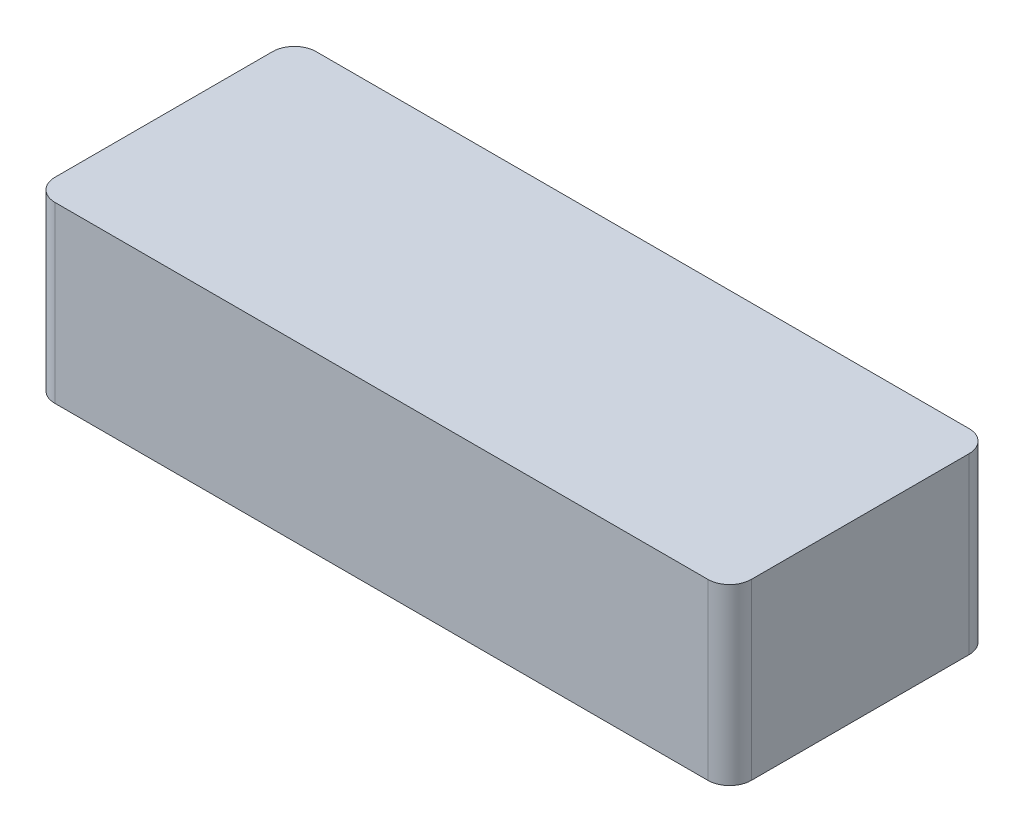
ISO-10303-21;
HEADER;
FILE_DESCRIPTION(('STEP AP214'),'2;1');
FILE_NAME('part.step','',(''),(''),'','','');
FILE_SCHEMA(('AUTOMOTIVE_DESIGN { 1 0 10303 214 1 1 1 1 }'));
ENDSEC;
DATA;
#1=APPLICATION_CONTEXT('core data for automotive mechanical design processes');
#2=APPLICATION_PROTOCOL_DEFINITION('international standard','automotive_design',2000,#1);
#3=PRODUCT_CONTEXT('',#1,'mechanical');
#4=PRODUCT('Part','Part','',(#3));
#5=PRODUCT_RELATED_PRODUCT_CATEGORY('part','',(#4));
#6=PRODUCT_DEFINITION_FORMATION('','',#4);
#7=PRODUCT_DEFINITION_CONTEXT('part definition',#1,'design');
#8=PRODUCT_DEFINITION('design','',#6,#7);
#9=PRODUCT_DEFINITION_SHAPE('','',#8);
#10=(LENGTH_UNIT() NAMED_UNIT(*) SI_UNIT(.MILLI.,.METRE.));
#11=(NAMED_UNIT(*) PLANE_ANGLE_UNIT() SI_UNIT($,.RADIAN.));
#12=(NAMED_UNIT(*) SI_UNIT($,.STERADIAN.) SOLID_ANGLE_UNIT());
#13=UNCERTAINTY_MEASURE_WITH_UNIT(LENGTH_MEASURE(1.E-05),#10,'distance_accuracy_value','');
#14=(GEOMETRIC_REPRESENTATION_CONTEXT(3) GLOBAL_UNCERTAINTY_ASSIGNED_CONTEXT((#13)) GLOBAL_UNIT_ASSIGNED_CONTEXT((#10,
#11,#12)) REPRESENTATION_CONTEXT('',''));
#15=CARTESIAN_POINT('',(0.,0.,0.));
#16=DIRECTION('',(0.,0.,1.));
#17=DIRECTION('',(1.,0.,0.));
#18=AXIS2_PLACEMENT_3D('',#15,#16,#17);
#19=CARTESIAN_POINT('',(80.,40.,30.));
#20=DIRECTION('',(-1.,0.,0.));
#21=DIRECTION('',(0.,0.,1.));
#22=AXIS2_PLACEMENT_3D('',#19,#20,#21);
#23=PLANE('',#22);
#24=DIRECTION('',(0.,0.,-1.));
#25=VECTOR('',#24,1.);
#26=CARTESIAN_POINT('',(80.,40.,30.));
#27=LINE('',#26,#25);
#28=CARTESIAN_POINT('',(80.,40.,25.));
#29=VERTEX_POINT('',#28);
#30=CARTESIAN_POINT('',(80.,40.,-25.));
#31=VERTEX_POINT('',#30);
#32=EDGE_CURVE('E120',#29,#31,#27,.T.);
#33=ORIENTED_EDGE('',*,*,#32,.F.);
#34=DIRECTION('',(0.,-1.,0.));
#35=VECTOR('',#34,1.);
#36=CARTESIAN_POINT('',(80.,40.,25.));
#37=LINE('',#36,#35);
#38=CARTESIAN_POINT('',(80.,0.,25.));
#39=VERTEX_POINT('',#38);
#40=EDGE_CURVE('E105',#29,#39,#37,.T.);
#41=ORIENTED_EDGE('',*,*,#40,.T.);
#42=DIRECTION('',(0.,0.,-1.));
#43=VECTOR('',#42,1.);
#44=CARTESIAN_POINT('',(80.,0.,30.));
#45=LINE('',#44,#43);
#46=CARTESIAN_POINT('',(80.,0.,-25.));
#47=VERTEX_POINT('',#46);
#48=EDGE_CURVE('E117',#39,#47,#45,.T.);
#49=ORIENTED_EDGE('',*,*,#48,.T.);
#50=DIRECTION('',(0.,-1.,0.));
#51=VECTOR('',#50,1.);
#52=CARTESIAN_POINT('',(80.,40.,-25.));
#53=LINE('',#52,#51);
#54=EDGE_CURVE('E122',#47,#31,#53,.F.);
#55=ORIENTED_EDGE('',*,*,#54,.T.);
#56=EDGE_LOOP('',(#33,#41,#49,#55));
#57=FACE_BOUND('',#56,.T.);
#58=ADVANCED_FACE('F36',(#57),#23,.F.);
#59=CARTESIAN_POINT('',(-80.,40.,-30.));
#60=DIRECTION('',(0.,0.,1.));
#61=DIRECTION('',(1.,0.,0.));
#62=AXIS2_PLACEMENT_3D('',#59,#60,#61);
#63=PLANE('',#62);
#64=DIRECTION('',(-1.,0.,0.));
#65=VECTOR('',#64,1.);
#66=CARTESIAN_POINT('',(-80.,40.,-30.));
#67=LINE('',#66,#65);
#68=CARTESIAN_POINT('',(75.,40.,-30.));
#69=VERTEX_POINT('',#68);
#70=CARTESIAN_POINT('',(-75.,40.,-30.));
#71=VERTEX_POINT('',#70);
#72=EDGE_CURVE('E171',#69,#71,#67,.T.);
#73=ORIENTED_EDGE('',*,*,#72,.F.);
#74=DIRECTION('',(0.,-1.,0.));
#75=VECTOR('',#74,1.);
#76=CARTESIAN_POINT('',(75.,40.,-30.));
#77=LINE('',#76,#75);
#78=CARTESIAN_POINT('',(75.,0.,-30.));
#79=VERTEX_POINT('',#78);
#80=EDGE_CURVE('E155',#69,#79,#77,.T.);
#81=ORIENTED_EDGE('',*,*,#80,.T.);
#82=DIRECTION('',(-1.,0.,0.));
#83=VECTOR('',#82,1.);
#84=CARTESIAN_POINT('',(-80.,0.,-30.));
#85=LINE('',#84,#83);
#86=CARTESIAN_POINT('',(-75.,0.,-30.));
#87=VERTEX_POINT('',#86);
#88=EDGE_CURVE('E126',#79,#87,#85,.T.);
#89=ORIENTED_EDGE('',*,*,#88,.T.);
#90=DIRECTION('',(0.,-1.,0.));
#91=VECTOR('',#90,1.);
#92=CARTESIAN_POINT('',(-75.,40.,-30.));
#93=LINE('',#92,#91);
#94=EDGE_CURVE('E153',#87,#71,#93,.F.);
#95=ORIENTED_EDGE('',*,*,#94,.T.);
#96=EDGE_LOOP('',(#73,#81,#89,#95));
#97=FACE_BOUND('',#96,.T.);
#98=ADVANCED_FACE('F181',(#97),#63,.F.);
#99=CARTESIAN_POINT('',(-80.,40.,30.));
#100=DIRECTION('',(1.,0.,0.));
#101=DIRECTION('',(0.,0.,-1.));
#102=AXIS2_PLACEMENT_3D('',#99,#100,#101);
#103=PLANE('',#102);
#104=DIRECTION('',(0.,0.,1.));
#105=VECTOR('',#104,1.);
#106=CARTESIAN_POINT('',(-80.,0.,30.));
#107=LINE('',#106,#105);
#108=CARTESIAN_POINT('',(-80.,0.,-25.));
#109=VERTEX_POINT('',#108);
#110=CARTESIAN_POINT('',(-80.,0.,25.));
#111=VERTEX_POINT('',#110);
#112=EDGE_CURVE('E129',#109,#111,#107,.T.);
#113=ORIENTED_EDGE('',*,*,#112,.T.);
#114=DIRECTION('',(0.,-1.,0.));
#115=VECTOR('',#114,1.);
#116=CARTESIAN_POINT('',(-80.,40.,25.));
#117=LINE('',#116,#115);
#118=CARTESIAN_POINT('',(-80.,40.,25.));
#119=VERTEX_POINT('',#118);
#120=EDGE_CURVE('E11',#111,#119,#117,.F.);
#121=ORIENTED_EDGE('',*,*,#120,.T.);
#122=DIRECTION('',(0.,0.,1.));
#123=VECTOR('',#122,1.);
#124=CARTESIAN_POINT('',(-80.,40.,30.));
#125=LINE('',#124,#123);
#126=CARTESIAN_POINT('',(-80.,40.,-25.));
#127=VERTEX_POINT('',#126);
#128=EDGE_CURVE('E161',#127,#119,#125,.T.);
#129=ORIENTED_EDGE('',*,*,#128,.F.);
#130=DIRECTION('',(0.,-1.,0.));
#131=VECTOR('',#130,1.);
#132=CARTESIAN_POINT('',(-80.,40.,-25.));
#133=LINE('',#132,#131);
#134=EDGE_CURVE('E44',#127,#109,#133,.T.);
#135=ORIENTED_EDGE('',*,*,#134,.T.);
#136=EDGE_LOOP('',(#113,#121,#129,#135));
#137=FACE_BOUND('',#136,.T.);
#138=ADVANCED_FACE('F160',(#137),#103,.F.);
#139=CARTESIAN_POINT('',(-80.,40.,30.));
#140=DIRECTION('',(0.,0.,-1.));
#141=DIRECTION('',(-1.,0.,0.));
#142=AXIS2_PLACEMENT_3D('',#139,#140,#141);
#143=PLANE('',#142);
#144=DIRECTION('',(1.,0.,0.));
#145=VECTOR('',#144,1.);
#146=CARTESIAN_POINT('',(-80.,0.,30.));
#147=LINE('',#146,#145);
#148=CARTESIAN_POINT('',(-75.,0.,30.));
#149=VERTEX_POINT('',#148);
#150=CARTESIAN_POINT('',(75.,0.,30.));
#151=VERTEX_POINT('',#150);
#152=EDGE_CURVE('E136',#149,#151,#147,.T.);
#153=ORIENTED_EDGE('',*,*,#152,.T.);
#154=DIRECTION('',(0.,-1.,0.));
#155=VECTOR('',#154,1.);
#156=CARTESIAN_POINT('',(75.,40.,30.));
#157=LINE('',#156,#155);
#158=CARTESIAN_POINT('',(75.,40.,30.));
#159=VERTEX_POINT('',#158);
#160=EDGE_CURVE('E106',#151,#159,#157,.F.);
#161=ORIENTED_EDGE('',*,*,#160,.T.);
#162=DIRECTION('',(1.,0.,0.));
#163=VECTOR('',#162,1.);
#164=CARTESIAN_POINT('',(-80.,40.,30.));
#165=LINE('',#164,#163);
#166=CARTESIAN_POINT('',(-75.,40.,30.));
#167=VERTEX_POINT('',#166);
#168=EDGE_CURVE('E132',#167,#159,#165,.T.);
#169=ORIENTED_EDGE('',*,*,#168,.F.);
#170=DIRECTION('',(0.,-1.,0.));
#171=VECTOR('',#170,1.);
#172=CARTESIAN_POINT('',(-75.,40.,30.));
#173=LINE('',#172,#171);
#174=EDGE_CURVE('E111',#167,#149,#173,.T.);
#175=ORIENTED_EDGE('',*,*,#174,.T.);
#176=EDGE_LOOP('',(#153,#161,#169,#175));
#177=FACE_BOUND('',#176,.T.);
#178=ADVANCED_FACE('F169',(#177),#143,.F.);
#179=CARTESIAN_POINT('',(0.,40.,0.));
#180=DIRECTION('',(0.,-1.,0.));
#181=DIRECTION('',(0.,0.,-1.));
#182=AXIS2_PLACEMENT_3D('',#179,#180,#181);
#183=PLANE('',#182);
#184=ORIENTED_EDGE('',*,*,#168,.T.);
#185=CARTESIAN_POINT('',(75.,40.,25.));
#186=DIRECTION('',(0.,-1.,0.));
#187=DIRECTION('',(0.,0.,-1.));
#188=AXIS2_PLACEMENT_3D('',#185,#186,#187);
#189=CIRCLE('',#188,5.);
#190=EDGE_CURVE('E151',#159,#29,#189,.F.);
#191=ORIENTED_EDGE('',*,*,#190,.T.);
#192=ORIENTED_EDGE('',*,*,#32,.T.);
#193=CARTESIAN_POINT('',(75.,40.,-25.));
#194=DIRECTION('',(0.,-1.,0.));
#195=DIRECTION('',(0.,0.,-1.));
#196=AXIS2_PLACEMENT_3D('',#193,#194,#195);
#197=CIRCLE('',#196,5.);
#198=EDGE_CURVE('E149',#31,#69,#197,.F.);
#199=ORIENTED_EDGE('',*,*,#198,.T.);
#200=ORIENTED_EDGE('',*,*,#72,.T.);
#201=CARTESIAN_POINT('',(-75.,40.,-25.));
#202=DIRECTION('',(0.,-1.,0.));
#203=DIRECTION('',(0.,0.,-1.));
#204=AXIS2_PLACEMENT_3D('',#201,#202,#203);
#205=CIRCLE('',#204,5.);
#206=EDGE_CURVE('E56',#71,#127,#205,.F.);
#207=ORIENTED_EDGE('',*,*,#206,.T.);
#208=ORIENTED_EDGE('',*,*,#128,.T.);
#209=CARTESIAN_POINT('',(-75.,40.,25.));
#210=DIRECTION('',(0.,-1.,0.));
#211=DIRECTION('',(0.,0.,-1.));
#212=AXIS2_PLACEMENT_3D('',#209,#210,#211);
#213=CIRCLE('',#212,5.);
#214=EDGE_CURVE('E147',#119,#167,#213,.F.);
#215=ORIENTED_EDGE('',*,*,#214,.T.);
#216=EDGE_LOOP('',(#184,#191,#192,#199,#200,#207,#208,#215));
#217=FACE_BOUND('',#216,.T.);
#218=ADVANCED_FACE('F175',(#217),#183,.F.);
#219=CARTESIAN_POINT('',(0.,0.,0.));
#220=DIRECTION('',(0.,-1.,0.));
#221=DIRECTION('',(0.,0.,-1.));
#222=AXIS2_PLACEMENT_3D('',#219,#220,#221);
#223=PLANE('',#222);
#224=ORIENTED_EDGE('',*,*,#48,.F.);
#225=CARTESIAN_POINT('',(75.,0.,25.));
#226=DIRECTION('',(0.,-1.,0.));
#227=DIRECTION('',(0.,0.,-1.));
#228=AXIS2_PLACEMENT_3D('',#225,#226,#227);
#229=CIRCLE('',#228,5.);
#230=EDGE_CURVE('E101',#39,#151,#229,.T.);
#231=ORIENTED_EDGE('',*,*,#230,.T.);
#232=ORIENTED_EDGE('',*,*,#152,.F.);
#233=CARTESIAN_POINT('',(-75.,0.,25.));
#234=DIRECTION('',(0.,-1.,0.));
#235=DIRECTION('',(0.,0.,-1.));
#236=AXIS2_PLACEMENT_3D('',#233,#234,#235);
#237=CIRCLE('',#236,5.);
#238=EDGE_CURVE('E140',#149,#111,#237,.T.);
#239=ORIENTED_EDGE('',*,*,#238,.T.);
#240=ORIENTED_EDGE('',*,*,#112,.F.);
#241=CARTESIAN_POINT('',(-75.,0.,-25.));
#242=DIRECTION('',(0.,-1.,0.));
#243=DIRECTION('',(0.,0.,-1.));
#244=AXIS2_PLACEMENT_3D('',#241,#242,#243);
#245=CIRCLE('',#244,5.);
#246=EDGE_CURVE('E121',#109,#87,#245,.T.);
#247=ORIENTED_EDGE('',*,*,#246,.T.);
#248=ORIENTED_EDGE('',*,*,#88,.F.);
#249=CARTESIAN_POINT('',(75.,0.,-25.));
#250=DIRECTION('',(0.,-1.,0.));
#251=DIRECTION('',(0.,0.,-1.));
#252=AXIS2_PLACEMENT_3D('',#249,#250,#251);
#253=CIRCLE('',#252,5.);
#254=EDGE_CURVE('E112',#79,#47,#253,.T.);
#255=ORIENTED_EDGE('',*,*,#254,.T.);
#256=EDGE_LOOP('',(#224,#231,#232,#239,#240,#247,#248,#255));
#257=FACE_BOUND('',#256,.T.);
#258=ADVANCED_FACE('F124',(#257),#223,.T.);
#259=CARTESIAN_POINT('',(75.,40.,25.));
#260=DIRECTION('',(0.,-1.,0.));
#261=DIRECTION('',(0.,0.,-1.));
#262=AXIS2_PLACEMENT_3D('',#259,#260,#261);
#263=CYLINDRICAL_SURFACE('',#262,5.);
#264=ORIENTED_EDGE('',*,*,#190,.F.);
#265=ORIENTED_EDGE('',*,*,#160,.F.);
#266=ORIENTED_EDGE('',*,*,#230,.F.);
#267=ORIENTED_EDGE('',*,*,#40,.F.);
#268=EDGE_LOOP('',(#264,#265,#266,#267));
#269=FACE_BOUND('',#268,.T.);
#270=ADVANCED_FACE('F104',(#269),#263,.T.);
#271=CARTESIAN_POINT('',(75.,40.,-25.));
#272=DIRECTION('',(0.,-1.,0.));
#273=DIRECTION('',(0.,0.,-1.));
#274=AXIS2_PLACEMENT_3D('',#271,#272,#273);
#275=CYLINDRICAL_SURFACE('',#274,5.);
#276=ORIENTED_EDGE('',*,*,#198,.F.);
#277=ORIENTED_EDGE('',*,*,#54,.F.);
#278=ORIENTED_EDGE('',*,*,#254,.F.);
#279=ORIENTED_EDGE('',*,*,#80,.F.);
#280=EDGE_LOOP('',(#276,#277,#278,#279));
#281=FACE_BOUND('',#280,.T.);
#282=ADVANCED_FACE('F179',(#281),#275,.T.);
#283=CARTESIAN_POINT('',(-75.,40.,25.));
#284=DIRECTION('',(0.,-1.,0.));
#285=DIRECTION('',(0.,0.,-1.));
#286=AXIS2_PLACEMENT_3D('',#283,#284,#285);
#287=CYLINDRICAL_SURFACE('',#286,5.);
#288=ORIENTED_EDGE('',*,*,#214,.F.);
#289=ORIENTED_EDGE('',*,*,#120,.F.);
#290=ORIENTED_EDGE('',*,*,#238,.F.);
#291=ORIENTED_EDGE('',*,*,#174,.F.);
#292=EDGE_LOOP('',(#288,#289,#290,#291));
#293=FACE_BOUND('',#292,.T.);
#294=ADVANCED_FACE('F166',(#293),#287,.T.);
#295=CARTESIAN_POINT('',(-75.,40.,-25.));
#296=DIRECTION('',(0.,-1.,0.));
#297=DIRECTION('',(0.,0.,-1.));
#298=AXIS2_PLACEMENT_3D('',#295,#296,#297);
#299=CYLINDRICAL_SURFACE('',#298,5.);
#300=ORIENTED_EDGE('',*,*,#206,.F.);
#301=ORIENTED_EDGE('',*,*,#94,.F.);
#302=ORIENTED_EDGE('',*,*,#246,.F.);
#303=ORIENTED_EDGE('',*,*,#134,.F.);
#304=EDGE_LOOP('',(#300,#301,#302,#303));
#305=FACE_BOUND('',#304,.T.);
#306=ADVANCED_FACE('F38',(#305),#299,.T.);
#307=CLOSED_SHELL('',(#58,#98,#138,#178,#218,#258,#270,#282,#294,#306));
#308=MANIFOLD_SOLID_BREP('B2',#307);
#309=ADVANCED_BREP_SHAPE_REPRESENTATION('',(#18,#308),#14);
#310=SHAPE_DEFINITION_REPRESENTATION(#9,#309);
ENDSEC;
END-ISO-10303-21;
